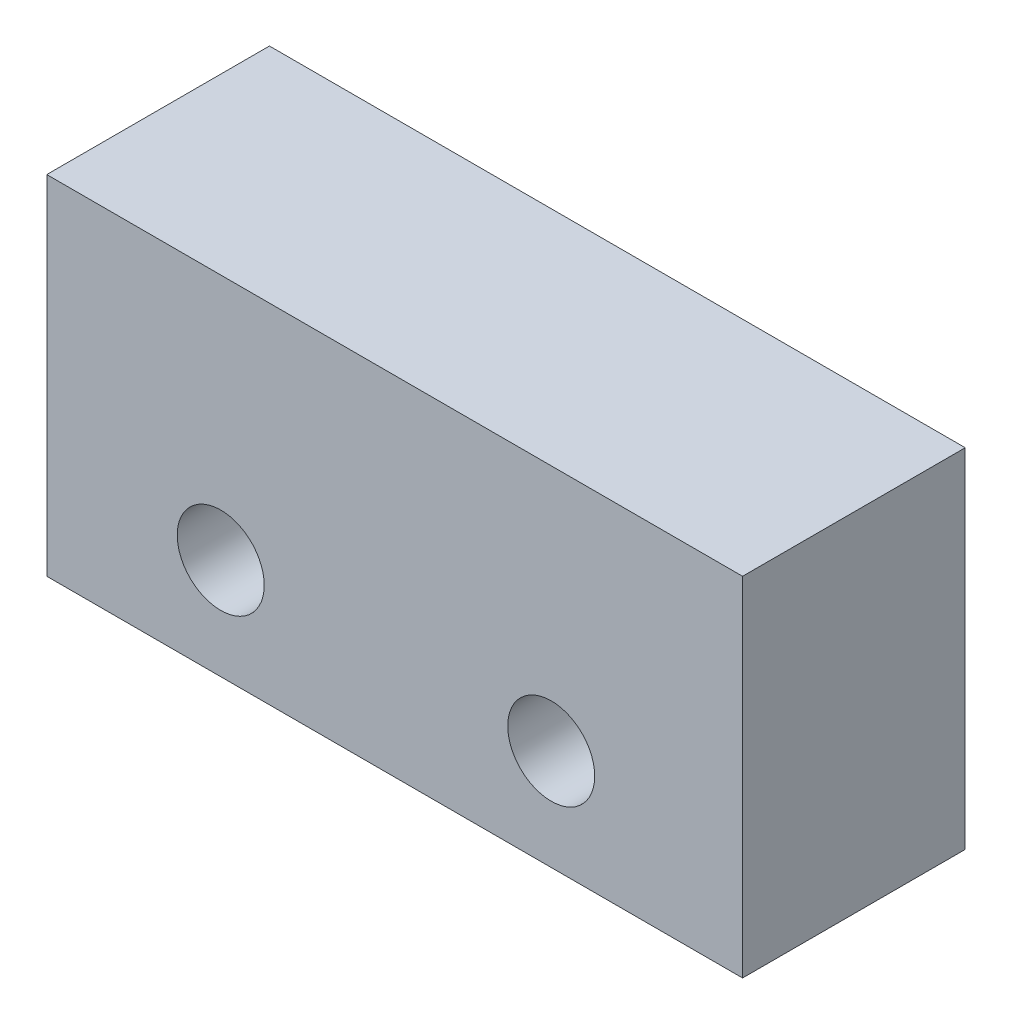
ISO-10303-21;
HEADER;
FILE_DESCRIPTION(('STEP AP214'),'2;1');
FILE_NAME('part.step','',(''),(''),'','','');
FILE_SCHEMA(('AUTOMOTIVE_DESIGN { 1 0 10303 214 1 1 1 1 }'));
ENDSEC;
DATA;
#1=APPLICATION_CONTEXT('core data for automotive mechanical design processes');
#2=APPLICATION_PROTOCOL_DEFINITION('international standard','automotive_design',2000,#1);
#3=PRODUCT_CONTEXT('',#1,'mechanical');
#4=PRODUCT('Part','Part','',(#3));
#5=PRODUCT_RELATED_PRODUCT_CATEGORY('part','',(#4));
#6=PRODUCT_DEFINITION_FORMATION('','',#4);
#7=PRODUCT_DEFINITION_CONTEXT('part definition',#1,'design');
#8=PRODUCT_DEFINITION('design','',#6,#7);
#9=PRODUCT_DEFINITION_SHAPE('','',#8);
#10=(LENGTH_UNIT() NAMED_UNIT(*) SI_UNIT(.MILLI.,.METRE.));
#11=(NAMED_UNIT(*) PLANE_ANGLE_UNIT() SI_UNIT($,.RADIAN.));
#12=(NAMED_UNIT(*) SI_UNIT($,.STERADIAN.) SOLID_ANGLE_UNIT());
#13=UNCERTAINTY_MEASURE_WITH_UNIT(LENGTH_MEASURE(1.E-05),#10,'distance_accuracy_value','');
#14=(GEOMETRIC_REPRESENTATION_CONTEXT(3) GLOBAL_UNCERTAINTY_ASSIGNED_CONTEXT((#13)) GLOBAL_UNIT_ASSIGNED_CONTEXT((#10,
#11,#12)) REPRESENTATION_CONTEXT('',''));
#15=CARTESIAN_POINT('',(0.,0.,0.));
#16=DIRECTION('',(0.,0.,1.));
#17=DIRECTION('',(1.,0.,0.));
#18=AXIS2_PLACEMENT_3D('',#15,#16,#17);
#19=CARTESIAN_POINT('',(0.,0.,6.4));
#20=DIRECTION('',(0.,0.,-1.));
#21=DIRECTION('',(-1.,0.,0.));
#22=AXIS2_PLACEMENT_3D('',#19,#20,#21);
#23=PLANE('',#22);
#24=DIRECTION('',(0.,1.,0.));
#25=VECTOR('',#24,1.);
#26=CARTESIAN_POINT('',(10.,-5.,6.4));
#27=LINE('',#26,#25);
#28=CARTESIAN_POINT('',(10.,-5.,6.4));
#29=VERTEX_POINT('',#28);
#30=CARTESIAN_POINT('',(10.,5.,6.4));
#31=VERTEX_POINT('',#30);
#32=EDGE_CURVE('E91',#29,#31,#27,.T.);
#33=ORIENTED_EDGE('',*,*,#32,.T.);
#34=DIRECTION('',(-1.,0.,0.));
#35=VECTOR('',#34,1.);
#36=CARTESIAN_POINT('',(-10.,5.,6.4));
#37=LINE('',#36,#35);
#38=CARTESIAN_POINT('',(-10.,5.,6.4));
#39=VERTEX_POINT('',#38);
#40=EDGE_CURVE('E86',#31,#39,#37,.T.);
#41=ORIENTED_EDGE('',*,*,#40,.T.);
#42=DIRECTION('',(0.,-1.,0.));
#43=VECTOR('',#42,1.);
#44=CARTESIAN_POINT('',(-10.,-5.,6.4));
#45=LINE('',#44,#43);
#46=CARTESIAN_POINT('',(-10.,-5.,6.4));
#47=VERTEX_POINT('',#46);
#48=EDGE_CURVE('E89',#39,#47,#45,.T.);
#49=ORIENTED_EDGE('',*,*,#48,.T.);
#50=DIRECTION('',(1.,0.,0.));
#51=VECTOR('',#50,1.);
#52=CARTESIAN_POINT('',(-10.,-5.,6.4));
#53=LINE('',#52,#51);
#54=EDGE_CURVE('E56',#47,#29,#53,.T.);
#55=ORIENTED_EDGE('',*,*,#54,.T.);
#56=EDGE_LOOP('',(#33,#41,#49,#55));
#57=FACE_BOUND('',#56,.T.);
#58=CARTESIAN_POINT('',(-5.,-2.1,6.4));
#59=DIRECTION('',(0.,0.,1.));
#60=DIRECTION('',(1.,0.,0.));
#61=AXIS2_PLACEMENT_3D('',#58,#59,#60);
#62=CIRCLE('',#61,1.25);
#63=CARTESIAN_POINT('',(-3.75,-2.1,6.4));
#64=VERTEX_POINT('',#63);
#65=EDGE_CURVE('E106',#64,#64,#62,.T.);
#66=ORIENTED_EDGE('',*,*,#65,.F.);
#67=EDGE_LOOP('',(#66));
#68=FACE_BOUND('',#67,.T.);
#69=CARTESIAN_POINT('',(4.5,-2.1,6.4));
#70=DIRECTION('',(0.,0.,1.));
#71=DIRECTION('',(1.,0.,0.));
#72=AXIS2_PLACEMENT_3D('',#69,#70,#71);
#73=CIRCLE('',#72,1.25);
#74=CARTESIAN_POINT('',(5.75,-2.1,6.4));
#75=VERTEX_POINT('',#74);
#76=EDGE_CURVE('E121',#75,#75,#73,.T.);
#77=ORIENTED_EDGE('',*,*,#76,.F.);
#78=EDGE_LOOP('',(#77));
#79=FACE_BOUND('',#78,.T.);
#80=ADVANCED_FACE('F39',(#57,#68,#79),#23,.F.);
#81=CARTESIAN_POINT('',(0.,0.,0.));
#82=DIRECTION('',(0.,0.,-1.));
#83=DIRECTION('',(-1.,0.,0.));
#84=AXIS2_PLACEMENT_3D('',#81,#82,#83);
#85=PLANE('',#84);
#86=CARTESIAN_POINT('',(-5.,-2.1,0.));
#87=DIRECTION('',(0.,0.,1.));
#88=DIRECTION('',(1.,0.,0.));
#89=AXIS2_PLACEMENT_3D('',#86,#87,#88);
#90=CIRCLE('',#89,1.25);
#91=CARTESIAN_POINT('',(-3.75,-2.1,0.));
#92=VERTEX_POINT('',#91);
#93=EDGE_CURVE('E118',#92,#92,#90,.T.);
#94=ORIENTED_EDGE('',*,*,#93,.T.);
#95=EDGE_LOOP('',(#94));
#96=FACE_BOUND('',#95,.T.);
#97=DIRECTION('',(0.,1.,0.));
#98=VECTOR('',#97,1.);
#99=CARTESIAN_POINT('',(10.,-5.,0.));
#100=LINE('',#99,#98);
#101=CARTESIAN_POINT('',(10.,-5.,0.));
#102=VERTEX_POINT('',#101);
#103=CARTESIAN_POINT('',(10.,5.,0.));
#104=VERTEX_POINT('',#103);
#105=EDGE_CURVE('E103',#102,#104,#100,.T.);
#106=ORIENTED_EDGE('',*,*,#105,.F.);
#107=DIRECTION('',(1.,0.,0.));
#108=VECTOR('',#107,1.);
#109=CARTESIAN_POINT('',(-10.,-5.,0.));
#110=LINE('',#109,#108);
#111=CARTESIAN_POINT('',(-10.,-5.,0.));
#112=VERTEX_POINT('',#111);
#113=EDGE_CURVE('E79',#112,#102,#110,.T.);
#114=ORIENTED_EDGE('',*,*,#113,.F.);
#115=DIRECTION('',(0.,-1.,0.));
#116=VECTOR('',#115,1.);
#117=CARTESIAN_POINT('',(-10.,-5.,0.));
#118=LINE('',#117,#116);
#119=CARTESIAN_POINT('',(-10.,5.,0.));
#120=VERTEX_POINT('',#119);
#121=EDGE_CURVE('E73',#120,#112,#118,.T.);
#122=ORIENTED_EDGE('',*,*,#121,.F.);
#123=DIRECTION('',(-1.,0.,0.));
#124=VECTOR('',#123,1.);
#125=CARTESIAN_POINT('',(-10.,5.,0.));
#126=LINE('',#125,#124);
#127=EDGE_CURVE('E95',#104,#120,#126,.T.);
#128=ORIENTED_EDGE('',*,*,#127,.F.);
#129=EDGE_LOOP('',(#106,#114,#122,#128));
#130=FACE_BOUND('',#129,.T.);
#131=CARTESIAN_POINT('',(4.5,-2.1,0.));
#132=DIRECTION('',(0.,0.,1.));
#133=DIRECTION('',(1.,0.,0.));
#134=AXIS2_PLACEMENT_3D('',#131,#132,#133);
#135=CIRCLE('',#134,1.25);
#136=CARTESIAN_POINT('',(5.75,-2.1,0.));
#137=VERTEX_POINT('',#136);
#138=EDGE_CURVE('E124',#137,#137,#135,.T.);
#139=ORIENTED_EDGE('',*,*,#138,.T.);
#140=EDGE_LOOP('',(#139));
#141=FACE_BOUND('',#140,.T.);
#142=ADVANCED_FACE('F114',(#96,#130,#141),#85,.T.);
#143=CARTESIAN_POINT('',(10.,-5.,6.4));
#144=DIRECTION('',(-1.,0.,0.));
#145=DIRECTION('',(0.,0.,1.));
#146=AXIS2_PLACEMENT_3D('',#143,#144,#145);
#147=PLANE('',#146);
#148=ORIENTED_EDGE('',*,*,#105,.T.);
#149=DIRECTION('',(0.,0.,-1.));
#150=VECTOR('',#149,1.);
#151=CARTESIAN_POINT('',(10.,5.,6.4));
#152=LINE('',#151,#150);
#153=EDGE_CURVE('E11',#31,#104,#152,.T.);
#154=ORIENTED_EDGE('',*,*,#153,.F.);
#155=ORIENTED_EDGE('',*,*,#32,.F.);
#156=DIRECTION('',(0.,0.,-1.));
#157=VECTOR('',#156,1.);
#158=CARTESIAN_POINT('',(10.,-5.,6.4));
#159=LINE('',#158,#157);
#160=EDGE_CURVE('E99',#29,#102,#159,.T.);
#161=ORIENTED_EDGE('',*,*,#160,.T.);
#162=EDGE_LOOP('',(#148,#154,#155,#161));
#163=FACE_BOUND('',#162,.T.);
#164=ADVANCED_FACE('F41',(#163),#147,.F.);
#165=CARTESIAN_POINT('',(-10.,5.,6.4));
#166=DIRECTION('',(0.,-1.,0.));
#167=DIRECTION('',(0.,0.,-1.));
#168=AXIS2_PLACEMENT_3D('',#165,#166,#167);
#169=PLANE('',#168);
#170=ORIENTED_EDGE('',*,*,#127,.T.);
#171=DIRECTION('',(0.,0.,-1.));
#172=VECTOR('',#171,1.);
#173=CARTESIAN_POINT('',(-10.,5.,6.4));
#174=LINE('',#173,#172);
#175=EDGE_CURVE('E48',#39,#120,#174,.T.);
#176=ORIENTED_EDGE('',*,*,#175,.F.);
#177=ORIENTED_EDGE('',*,*,#40,.F.);
#178=ORIENTED_EDGE('',*,*,#153,.T.);
#179=EDGE_LOOP('',(#170,#176,#177,#178));
#180=FACE_BOUND('',#179,.T.);
#181=ADVANCED_FACE('F94',(#180),#169,.F.);
#182=CARTESIAN_POINT('',(-10.,-5.,6.4));
#183=DIRECTION('',(1.,0.,0.));
#184=DIRECTION('',(0.,0.,-1.));
#185=AXIS2_PLACEMENT_3D('',#182,#183,#184);
#186=PLANE('',#185);
#187=ORIENTED_EDGE('',*,*,#121,.T.);
#188=DIRECTION('',(0.,0.,-1.));
#189=VECTOR('',#188,1.);
#190=CARTESIAN_POINT('',(-10.,-5.,6.4));
#191=LINE('',#190,#189);
#192=EDGE_CURVE('E96',#47,#112,#191,.T.);
#193=ORIENTED_EDGE('',*,*,#192,.F.);
#194=ORIENTED_EDGE('',*,*,#48,.F.);
#195=ORIENTED_EDGE('',*,*,#175,.T.);
#196=EDGE_LOOP('',(#187,#193,#194,#195));
#197=FACE_BOUND('',#196,.T.);
#198=ADVANCED_FACE('F97',(#197),#186,.F.);
#199=CARTESIAN_POINT('',(-10.,-5.,6.4));
#200=DIRECTION('',(0.,1.,0.));
#201=DIRECTION('',(0.,0.,1.));
#202=AXIS2_PLACEMENT_3D('',#199,#200,#201);
#203=PLANE('',#202);
#204=ORIENTED_EDGE('',*,*,#113,.T.);
#205=ORIENTED_EDGE('',*,*,#160,.F.);
#206=ORIENTED_EDGE('',*,*,#54,.F.);
#207=ORIENTED_EDGE('',*,*,#192,.T.);
#208=EDGE_LOOP('',(#204,#205,#206,#207));
#209=FACE_BOUND('',#208,.T.);
#210=ADVANCED_FACE('F111',(#209),#203,.F.);
#211=CARTESIAN_POINT('',(-5.,-2.1,6.4));
#212=DIRECTION('',(0.,0.,-1.));
#213=DIRECTION('',(-1.,0.,0.));
#214=AXIS2_PLACEMENT_3D('',#211,#212,#213);
#215=CYLINDRICAL_SURFACE('',#214,1.25);
#216=ORIENTED_EDGE('',*,*,#65,.T.);
#217=EDGE_LOOP('',(#216));
#218=FACE_BOUND('',#217,.T.);
#219=ORIENTED_EDGE('',*,*,#93,.F.);
#220=EDGE_LOOP('',(#219));
#221=FACE_BOUND('',#220,.T.);
#222=ADVANCED_FACE('F141',(#218,#221),#215,.F.);
#223=CARTESIAN_POINT('',(4.5,-2.1,6.4));
#224=DIRECTION('',(0.,0.,-1.));
#225=DIRECTION('',(-1.,0.,0.));
#226=AXIS2_PLACEMENT_3D('',#223,#224,#225);
#227=CYLINDRICAL_SURFACE('',#226,1.25);
#228=ORIENTED_EDGE('',*,*,#76,.T.);
#229=EDGE_LOOP('',(#228));
#230=FACE_BOUND('',#229,.T.);
#231=ORIENTED_EDGE('',*,*,#138,.F.);
#232=EDGE_LOOP('',(#231));
#233=FACE_BOUND('',#232,.T.);
#234=ADVANCED_FACE('F130',(#230,#233),#227,.F.);
#235=CLOSED_SHELL('',(#80,#142,#164,#181,#198,#210,#222,#234));
#236=MANIFOLD_SOLID_BREP('B2',#235);
#237=ADVANCED_BREP_SHAPE_REPRESENTATION('',(#18,#236),#14);
#238=SHAPE_DEFINITION_REPRESENTATION(#9,#237);
ENDSEC;
END-ISO-10303-21;
